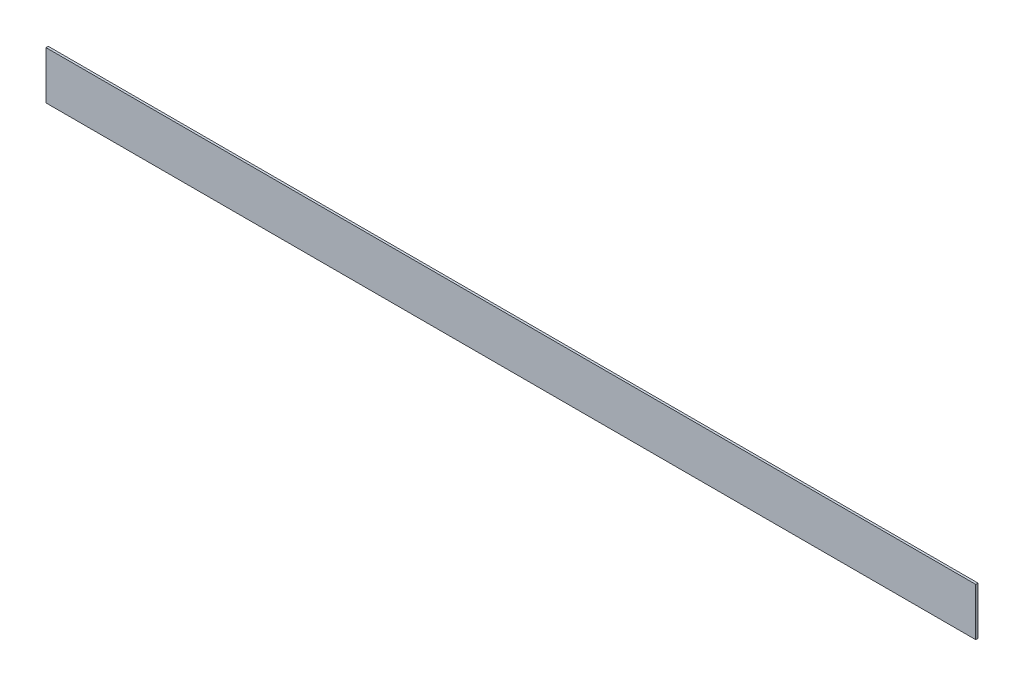
ISO-10303-21;
HEADER;
FILE_DESCRIPTION(('STEP AP214'),'2;1');
FILE_NAME('part.step','',(''),(''),'','','');
FILE_SCHEMA(('AUTOMOTIVE_DESIGN { 1 0 10303 214 1 1 1 1 }'));
ENDSEC;
DATA;
#1=APPLICATION_CONTEXT('core data for automotive mechanical design processes');
#2=APPLICATION_PROTOCOL_DEFINITION('international standard','automotive_design',2000,#1);
#3=PRODUCT_CONTEXT('',#1,'mechanical');
#4=PRODUCT('Part','Part','',(#3));
#5=PRODUCT_RELATED_PRODUCT_CATEGORY('part','',(#4));
#6=PRODUCT_DEFINITION_FORMATION('','',#4);
#7=PRODUCT_DEFINITION_CONTEXT('part definition',#1,'design');
#8=PRODUCT_DEFINITION('design','',#6,#7);
#9=PRODUCT_DEFINITION_SHAPE('','',#8);
#10=(LENGTH_UNIT() NAMED_UNIT(*) SI_UNIT(.MILLI.,.METRE.));
#11=(NAMED_UNIT(*) PLANE_ANGLE_UNIT() SI_UNIT($,.RADIAN.));
#12=(NAMED_UNIT(*) SI_UNIT($,.STERADIAN.) SOLID_ANGLE_UNIT());
#13=UNCERTAINTY_MEASURE_WITH_UNIT(LENGTH_MEASURE(1.E-05),#10,'distance_accuracy_value','');
#14=(GEOMETRIC_REPRESENTATION_CONTEXT(3) GLOBAL_UNCERTAINTY_ASSIGNED_CONTEXT((#13)) GLOBAL_UNIT_ASSIGNED_CONTEXT((#10,
#11,#12)) REPRESENTATION_CONTEXT('',''));
#15=CARTESIAN_POINT('',(0.,0.,0.));
#16=DIRECTION('',(0.,0.,1.));
#17=DIRECTION('',(1.,0.,0.));
#18=AXIS2_PLACEMENT_3D('',#15,#16,#17);
#19=CARTESIAN_POINT('',(0.,0.,5.));
#20=DIRECTION('',(1.,0.,0.));
#21=DIRECTION('',(0.,0.,-1.));
#22=AXIS2_PLACEMENT_3D('',#19,#20,#21);
#23=PLANE('',#22);
#24=DIRECTION('',(0.,-1.,0.));
#25=VECTOR('',#24,1.);
#26=CARTESIAN_POINT('',(0.,0.,0.));
#27=LINE('',#26,#25);
#28=CARTESIAN_POINT('',(0.,106.,0.));
#29=VERTEX_POINT('',#28);
#30=CARTESIAN_POINT('',(0.,0.,0.));
#31=VERTEX_POINT('',#30);
#32=EDGE_CURVE('E97',#29,#31,#27,.T.);
#33=ORIENTED_EDGE('',*,*,#32,.T.);
#34=DIRECTION('',(0.,0.,-1.));
#35=VECTOR('',#34,1.);
#36=CARTESIAN_POINT('',(0.,0.,5.));
#37=LINE('',#36,#35);
#38=CARTESIAN_POINT('',(0.,0.,5.));
#39=VERTEX_POINT('',#38);
#40=EDGE_CURVE('E11',#39,#31,#37,.T.);
#41=ORIENTED_EDGE('',*,*,#40,.F.);
#42=DIRECTION('',(0.,-1.,0.));
#43=VECTOR('',#42,1.);
#44=CARTESIAN_POINT('',(0.,0.,5.));
#45=LINE('',#44,#43);
#46=CARTESIAN_POINT('',(0.,106.,5.));
#47=VERTEX_POINT('',#46);
#48=EDGE_CURVE('E85',#47,#39,#45,.T.);
#49=ORIENTED_EDGE('',*,*,#48,.F.);
#50=DIRECTION('',(0.,0.,-1.));
#51=VECTOR('',#50,1.);
#52=CARTESIAN_POINT('',(0.,106.,5.));
#53=LINE('',#52,#51);
#54=EDGE_CURVE('E93',#47,#29,#53,.T.);
#55=ORIENTED_EDGE('',*,*,#54,.T.);
#56=EDGE_LOOP('',(#33,#41,#49,#55));
#57=FACE_BOUND('',#56,.T.);
#58=ADVANCED_FACE('F34',(#57),#23,.F.);
#59=CARTESIAN_POINT('',(0.,0.,5.));
#60=DIRECTION('',(0.,1.,0.));
#61=DIRECTION('',(0.,0.,1.));
#62=AXIS2_PLACEMENT_3D('',#59,#60,#61);
#63=PLANE('',#62);
#64=DIRECTION('',(1.,0.,0.));
#65=VECTOR('',#64,1.);
#66=CARTESIAN_POINT('',(0.,0.,0.));
#67=LINE('',#66,#65);
#68=CARTESIAN_POINT('',(2056.,0.,0.));
#69=VERTEX_POINT('',#68);
#70=EDGE_CURVE('E89',#31,#69,#67,.T.);
#71=ORIENTED_EDGE('',*,*,#70,.T.);
#72=DIRECTION('',(0.,0.,-1.));
#73=VECTOR('',#72,1.);
#74=CARTESIAN_POINT('',(2056.,0.,5.));
#75=LINE('',#74,#73);
#76=CARTESIAN_POINT('',(2056.,0.,5.));
#77=VERTEX_POINT('',#76);
#78=EDGE_CURVE('E42',#77,#69,#75,.T.);
#79=ORIENTED_EDGE('',*,*,#78,.F.);
#80=DIRECTION('',(1.,0.,0.));
#81=VECTOR('',#80,1.);
#82=CARTESIAN_POINT('',(0.,0.,5.));
#83=LINE('',#82,#81);
#84=EDGE_CURVE('E80',#39,#77,#83,.T.);
#85=ORIENTED_EDGE('',*,*,#84,.F.);
#86=ORIENTED_EDGE('',*,*,#40,.T.);
#87=EDGE_LOOP('',(#71,#79,#85,#86));
#88=FACE_BOUND('',#87,.T.);
#89=ADVANCED_FACE('F88',(#88),#63,.F.);
#90=CARTESIAN_POINT('',(2056.,0.,5.));
#91=DIRECTION('',(-1.,0.,0.));
#92=DIRECTION('',(0.,0.,1.));
#93=AXIS2_PLACEMENT_3D('',#90,#91,#92);
#94=PLANE('',#93);
#95=DIRECTION('',(0.,1.,0.));
#96=VECTOR('',#95,1.);
#97=CARTESIAN_POINT('',(2056.,0.,0.));
#98=LINE('',#97,#96);
#99=CARTESIAN_POINT('',(2056.,106.,0.));
#100=VERTEX_POINT('',#99);
#101=EDGE_CURVE('E67',#69,#100,#98,.T.);
#102=ORIENTED_EDGE('',*,*,#101,.T.);
#103=DIRECTION('',(0.,0.,-1.));
#104=VECTOR('',#103,1.);
#105=CARTESIAN_POINT('',(2056.,106.,5.));
#106=LINE('',#105,#104);
#107=CARTESIAN_POINT('',(2056.,106.,5.));
#108=VERTEX_POINT('',#107);
#109=EDGE_CURVE('E90',#108,#100,#106,.T.);
#110=ORIENTED_EDGE('',*,*,#109,.F.);
#111=DIRECTION('',(0.,1.,0.));
#112=VECTOR('',#111,1.);
#113=CARTESIAN_POINT('',(2056.,0.,5.));
#114=LINE('',#113,#112);
#115=EDGE_CURVE('E83',#77,#108,#114,.T.);
#116=ORIENTED_EDGE('',*,*,#115,.F.);
#117=ORIENTED_EDGE('',*,*,#78,.T.);
#118=EDGE_LOOP('',(#102,#110,#116,#117));
#119=FACE_BOUND('',#118,.T.);
#120=ADVANCED_FACE('F91',(#119),#94,.F.);
#121=CARTESIAN_POINT('',(0.,106.,5.));
#122=DIRECTION('',(0.,-1.,0.));
#123=DIRECTION('',(0.,0.,-1.));
#124=AXIS2_PLACEMENT_3D('',#121,#122,#123);
#125=PLANE('',#124);
#126=DIRECTION('',(-1.,0.,0.));
#127=VECTOR('',#126,1.);
#128=CARTESIAN_POINT('',(0.,106.,0.));
#129=LINE('',#128,#127);
#130=EDGE_CURVE('E73',#100,#29,#129,.T.);
#131=ORIENTED_EDGE('',*,*,#130,.T.);
#132=ORIENTED_EDGE('',*,*,#54,.F.);
#133=DIRECTION('',(-1.,0.,0.));
#134=VECTOR('',#133,1.);
#135=CARTESIAN_POINT('',(0.,106.,5.));
#136=LINE('',#135,#134);
#137=EDGE_CURVE('E50',#108,#47,#136,.T.);
#138=ORIENTED_EDGE('',*,*,#137,.F.);
#139=ORIENTED_EDGE('',*,*,#109,.T.);
#140=EDGE_LOOP('',(#131,#132,#138,#139));
#141=FACE_BOUND('',#140,.T.);
#142=ADVANCED_FACE('F104',(#141),#125,.F.);
#143=CARTESIAN_POINT('',(0.,0.,5.));
#144=DIRECTION('',(0.,0.,-1.));
#145=DIRECTION('',(-1.,0.,0.));
#146=AXIS2_PLACEMENT_3D('',#143,#144,#145);
#147=PLANE('',#146);
#148=ORIENTED_EDGE('',*,*,#48,.T.);
#149=ORIENTED_EDGE('',*,*,#84,.T.);
#150=ORIENTED_EDGE('',*,*,#115,.T.);
#151=ORIENTED_EDGE('',*,*,#137,.T.);
#152=EDGE_LOOP('',(#148,#149,#150,#151));
#153=FACE_BOUND('',#152,.T.);
#154=ADVANCED_FACE('F81',(#153),#147,.F.);
#155=CARTESIAN_POINT('',(0.,0.,0.));
#156=DIRECTION('',(0.,0.,-1.));
#157=DIRECTION('',(-1.,0.,0.));
#158=AXIS2_PLACEMENT_3D('',#155,#156,#157);
#159=PLANE('',#158);
#160=ORIENTED_EDGE('',*,*,#32,.F.);
#161=ORIENTED_EDGE('',*,*,#130,.F.);
#162=ORIENTED_EDGE('',*,*,#101,.F.);
#163=ORIENTED_EDGE('',*,*,#70,.F.);
#164=EDGE_LOOP('',(#160,#161,#162,#163));
#165=FACE_BOUND('',#164,.T.);
#166=ADVANCED_FACE('F107',(#165),#159,.T.);
#167=CLOSED_SHELL('',(#58,#89,#120,#142,#154,#166));
#168=MANIFOLD_SOLID_BREP('B2',#167);
#169=ADVANCED_BREP_SHAPE_REPRESENTATION('',(#18,#168),#14);
#170=SHAPE_DEFINITION_REPRESENTATION(#9,#169);
ENDSEC;
END-ISO-10303-21;
